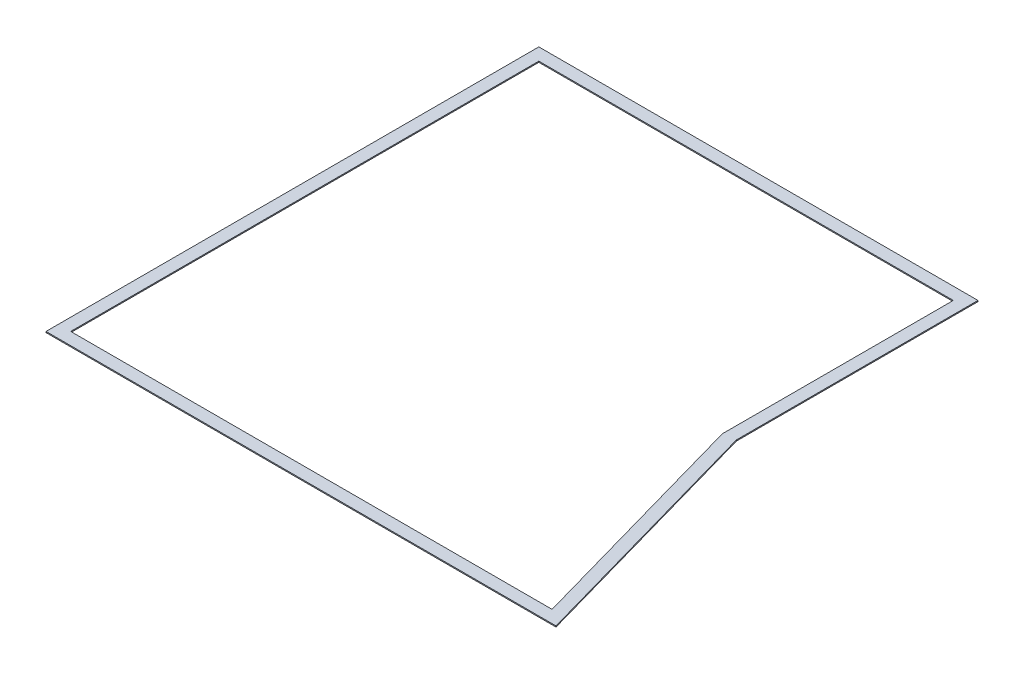
ISO-10303-21;
HEADER;
FILE_DESCRIPTION(('STEP AP214'),'2;1');
FILE_NAME('part.step','',(''),(''),'','','');
FILE_SCHEMA(('AUTOMOTIVE_DESIGN { 1 0 10303 214 1 1 1 1 }'));
ENDSEC;
DATA;
#1=APPLICATION_CONTEXT('core data for automotive mechanical design processes');
#2=APPLICATION_PROTOCOL_DEFINITION('international standard','automotive_design',2000,#1);
#3=PRODUCT_CONTEXT('',#1,'mechanical');
#4=PRODUCT('Part','Part','',(#3));
#5=PRODUCT_RELATED_PRODUCT_CATEGORY('part','',(#4));
#6=PRODUCT_DEFINITION_FORMATION('','',#4);
#7=PRODUCT_DEFINITION_CONTEXT('part definition',#1,'design');
#8=PRODUCT_DEFINITION('design','',#6,#7);
#9=PRODUCT_DEFINITION_SHAPE('','',#8);
#10=(LENGTH_UNIT() NAMED_UNIT(*) SI_UNIT(.MILLI.,.METRE.));
#11=(NAMED_UNIT(*) PLANE_ANGLE_UNIT() SI_UNIT($,.RADIAN.));
#12=(NAMED_UNIT(*) SI_UNIT($,.STERADIAN.) SOLID_ANGLE_UNIT());
#13=UNCERTAINTY_MEASURE_WITH_UNIT(LENGTH_MEASURE(1.E-05),#10,'distance_accuracy_value','');
#14=(GEOMETRIC_REPRESENTATION_CONTEXT(3) GLOBAL_UNCERTAINTY_ASSIGNED_CONTEXT((#13)) GLOBAL_UNIT_ASSIGNED_CONTEXT((#10,
#11,#12)) REPRESENTATION_CONTEXT('',''));
#15=CARTESIAN_POINT('',(0.,0.,0.));
#16=DIRECTION('',(0.,0.,1.));
#17=DIRECTION('',(1.,0.,0.));
#18=AXIS2_PLACEMENT_3D('',#15,#16,#17);
#19=CARTESIAN_POINT('',(0.,2.,0.));
#20=DIRECTION('',(0.,1.,0.));
#21=DIRECTION('',(0.,0.,1.));
#22=AXIS2_PLACEMENT_3D('',#19,#20,#21);
#23=PLANE('',#22);
#24=DIRECTION('',(-1.,0.,0.));
#25=VECTOR('',#24,1.);
#26=CARTESIAN_POINT('',(409.,2.,-458.));
#27=LINE('',#26,#25);
#28=CARTESIAN_POINT('',(409.,2.,-458.));
#29=VERTEX_POINT('',#28);
#30=CARTESIAN_POINT('',(-409.,2.,-458.));
#31=VERTEX_POINT('',#30);
#32=EDGE_CURVE('E156',#29,#31,#27,.T.);
#33=ORIENTED_EDGE('',*,*,#32,.T.);
#34=DIRECTION('',(0.,0.,1.));
#35=VECTOR('',#34,1.);
#36=CARTESIAN_POINT('',(-409.,2.,-458.));
#37=LINE('',#36,#35);
#38=CARTESIAN_POINT('',(-409.,2.,460.));
#39=VERTEX_POINT('',#38);
#40=EDGE_CURVE('E159',#31,#39,#37,.T.);
#41=ORIENTED_EDGE('',*,*,#40,.T.);
#42=DIRECTION('',(1.,0.,0.));
#43=VECTOR('',#42,1.);
#44=CARTESIAN_POINT('',(-409.,2.,460.));
#45=LINE('',#44,#43);
#46=CARTESIAN_POINT('',(541.,2.,460.));
#47=VERTEX_POINT('',#46);
#48=EDGE_CURVE('E162',#39,#47,#45,.T.);
#49=ORIENTED_EDGE('',*,*,#48,.T.);
#50=DIRECTION('',(-0.271460165021806,0.,-0.962449675986404));
#51=VECTOR('',#50,1.);
#52=CARTESIAN_POINT('',(541.,2.,460.));
#53=LINE('',#52,#51);
#54=CARTESIAN_POINT('',(409.,2.,-8.00000000000006));
#55=VERTEX_POINT('',#54);
#56=EDGE_CURVE('E164',#47,#55,#53,.T.);
#57=ORIENTED_EDGE('',*,*,#56,.T.);
#58=DIRECTION('',(0.,0.,-1.));
#59=VECTOR('',#58,1.);
#60=CARTESIAN_POINT('',(409.,2.,-8.00000000000006));
#61=LINE('',#60,#59);
#62=EDGE_CURVE('E166',#55,#29,#61,.T.);
#63=ORIENTED_EDGE('',*,*,#62,.T.);
#64=EDGE_LOOP('',(#33,#41,#49,#57,#63));
#65=FACE_BOUND('',#64,.T.);
#66=DIRECTION('',(-1.,0.,0.));
#67=VECTOR('',#66,1.);
#68=CARTESIAN_POINT('',(386.,2.,-435.));
#69=LINE('',#68,#67);
#70=CARTESIAN_POINT('',(386.,2.,-435.));
#71=VERTEX_POINT('',#70);
#72=CARTESIAN_POINT('',(-386.,2.,-435.));
#73=VERTEX_POINT('',#72);
#74=EDGE_CURVE('E120',#71,#73,#69,.T.);
#75=ORIENTED_EDGE('',*,*,#74,.F.);
#76=DIRECTION('',(0.,0.,-1.));
#77=VECTOR('',#76,1.);
#78=CARTESIAN_POINT('',(386.,2.,-4.81847444451644));
#79=LINE('',#78,#77);
#80=CARTESIAN_POINT('',(386.,2.,-4.81847444451644));
#81=VERTEX_POINT('',#80);
#82=EDGE_CURVE('E112',#81,#71,#79,.T.);
#83=ORIENTED_EDGE('',*,*,#82,.F.);
#84=DIRECTION('',(-0.271460165021806,0.,-0.962449675986404));
#85=VECTOR('',#84,1.);
#86=CARTESIAN_POINT('',(510.615467151017,2.,437.));
#87=LINE('',#86,#85);
#88=CARTESIAN_POINT('',(510.615467151017,2.,437.));
#89=VERTEX_POINT('',#88);
#90=EDGE_CURVE('E139',#89,#81,#87,.T.);
#91=ORIENTED_EDGE('',*,*,#90,.F.);
#92=DIRECTION('',(1.,0.,0.));
#93=VECTOR('',#92,1.);
#94=CARTESIAN_POINT('',(-386.,2.,437.));
#95=LINE('',#94,#93);
#96=CARTESIAN_POINT('',(-386.,2.,437.));
#97=VERTEX_POINT('',#96);
#98=EDGE_CURVE('E135',#97,#89,#95,.T.);
#99=ORIENTED_EDGE('',*,*,#98,.F.);
#100=DIRECTION('',(0.,0.,1.));
#101=VECTOR('',#100,1.);
#102=CARTESIAN_POINT('',(-386.,2.,-435.));
#103=LINE('',#102,#101);
#104=EDGE_CURVE('E133',#73,#97,#103,.T.);
#105=ORIENTED_EDGE('',*,*,#104,.F.);
#106=EDGE_LOOP('',(#75,#83,#91,#99,#105));
#107=FACE_BOUND('',#106,.T.);
#108=ADVANCED_FACE('F35',(#65,#107),#23,.T.);
#109=CARTESIAN_POINT('',(0.,0.,0.));
#110=DIRECTION('',(0.,1.,0.));
#111=DIRECTION('',(0.,0.,1.));
#112=AXIS2_PLACEMENT_3D('',#109,#110,#111);
#113=PLANE('',#112);
#114=DIRECTION('',(-1.,0.,0.));
#115=VECTOR('',#114,1.);
#116=CARTESIAN_POINT('',(409.,0.,-458.));
#117=LINE('',#116,#115);
#118=CARTESIAN_POINT('',(409.,0.,-458.));
#119=VERTEX_POINT('',#118);
#120=CARTESIAN_POINT('',(-409.,0.,-458.));
#121=VERTEX_POINT('',#120);
#122=EDGE_CURVE('E128',#119,#121,#117,.T.);
#123=ORIENTED_EDGE('',*,*,#122,.F.);
#124=DIRECTION('',(0.,0.,-1.));
#125=VECTOR('',#124,1.);
#126=CARTESIAN_POINT('',(409.,0.,-8.00000000000006));
#127=LINE('',#126,#125);
#128=CARTESIAN_POINT('',(409.,0.,-8.00000000000006));
#129=VERTEX_POINT('',#128);
#130=EDGE_CURVE('E160',#129,#119,#127,.T.);
#131=ORIENTED_EDGE('',*,*,#130,.F.);
#132=DIRECTION('',(-0.271460165021806,0.,-0.962449675986404));
#133=VECTOR('',#132,1.);
#134=CARTESIAN_POINT('',(541.,0.,460.));
#135=LINE('',#134,#133);
#136=CARTESIAN_POINT('',(541.,0.,460.));
#137=VERTEX_POINT('',#136);
#138=EDGE_CURVE('E175',#137,#129,#135,.T.);
#139=ORIENTED_EDGE('',*,*,#138,.F.);
#140=DIRECTION('',(1.,0.,0.));
#141=VECTOR('',#140,1.);
#142=CARTESIAN_POINT('',(-409.,0.,460.));
#143=LINE('',#142,#141);
#144=CARTESIAN_POINT('',(-409.,0.,460.));
#145=VERTEX_POINT('',#144);
#146=EDGE_CURVE('E173',#145,#137,#143,.T.);
#147=ORIENTED_EDGE('',*,*,#146,.F.);
#148=DIRECTION('',(0.,0.,1.));
#149=VECTOR('',#148,1.);
#150=CARTESIAN_POINT('',(-409.,0.,-458.));
#151=LINE('',#150,#149);
#152=EDGE_CURVE('E171',#121,#145,#151,.T.);
#153=ORIENTED_EDGE('',*,*,#152,.F.);
#154=EDGE_LOOP('',(#123,#131,#139,#147,#153));
#155=FACE_BOUND('',#154,.T.);
#156=DIRECTION('',(0.,0.,-1.));
#157=VECTOR('',#156,1.);
#158=CARTESIAN_POINT('',(386.,0.,-4.81847444451644));
#159=LINE('',#158,#157);
#160=CARTESIAN_POINT('',(386.,0.,-4.81847444451644));
#161=VERTEX_POINT('',#160);
#162=CARTESIAN_POINT('',(386.,0.,-435.));
#163=VERTEX_POINT('',#162);
#164=EDGE_CURVE('E58',#161,#163,#159,.T.);
#165=ORIENTED_EDGE('',*,*,#164,.T.);
#166=DIRECTION('',(-1.,0.,0.));
#167=VECTOR('',#166,1.);
#168=CARTESIAN_POINT('',(386.,0.,-435.));
#169=LINE('',#168,#167);
#170=CARTESIAN_POINT('',(-386.,0.,-435.));
#171=VERTEX_POINT('',#170);
#172=EDGE_CURVE('E127',#163,#171,#169,.T.);
#173=ORIENTED_EDGE('',*,*,#172,.T.);
#174=DIRECTION('',(0.,0.,1.));
#175=VECTOR('',#174,1.);
#176=CARTESIAN_POINT('',(-386.,0.,-435.));
#177=LINE('',#176,#175);
#178=CARTESIAN_POINT('',(-386.,0.,437.));
#179=VERTEX_POINT('',#178);
#180=EDGE_CURVE('E143',#171,#179,#177,.T.);
#181=ORIENTED_EDGE('',*,*,#180,.T.);
#182=DIRECTION('',(1.,0.,0.));
#183=VECTOR('',#182,1.);
#184=CARTESIAN_POINT('',(-386.,0.,437.));
#185=LINE('',#184,#183);
#186=CARTESIAN_POINT('',(510.615467151017,0.,437.));
#187=VERTEX_POINT('',#186);
#188=EDGE_CURVE('E146',#179,#187,#185,.T.);
#189=ORIENTED_EDGE('',*,*,#188,.T.);
#190=DIRECTION('',(-0.271460165021806,0.,-0.962449675986404));
#191=VECTOR('',#190,1.);
#192=CARTESIAN_POINT('',(510.615467151017,0.,437.));
#193=LINE('',#192,#191);
#194=EDGE_CURVE('E121',#187,#161,#193,.T.);
#195=ORIENTED_EDGE('',*,*,#194,.T.);
#196=EDGE_LOOP('',(#165,#173,#181,#189,#195));
#197=FACE_BOUND('',#196,.T.);
#198=ADVANCED_FACE('F196',(#155,#197),#113,.F.);
#199=CARTESIAN_POINT('',(409.,2.,-458.));
#200=DIRECTION('',(0.,0.,1.));
#201=DIRECTION('',(1.,0.,0.));
#202=AXIS2_PLACEMENT_3D('',#199,#200,#201);
#203=PLANE('',#202);
#204=ORIENTED_EDGE('',*,*,#122,.T.);
#205=DIRECTION('',(0.,-1.,0.));
#206=VECTOR('',#205,1.);
#207=CARTESIAN_POINT('',(-409.,2.,-458.));
#208=LINE('',#207,#206);
#209=EDGE_CURVE('E11',#31,#121,#208,.T.);
#210=ORIENTED_EDGE('',*,*,#209,.F.);
#211=ORIENTED_EDGE('',*,*,#32,.F.);
#212=DIRECTION('',(0.,-1.,0.));
#213=VECTOR('',#212,1.);
#214=CARTESIAN_POINT('',(409.,2.,-458.));
#215=LINE('',#214,#213);
#216=EDGE_CURVE('E168',#29,#119,#215,.T.);
#217=ORIENTED_EDGE('',*,*,#216,.T.);
#218=EDGE_LOOP('',(#204,#210,#211,#217));
#219=FACE_BOUND('',#218,.T.);
#220=ADVANCED_FACE('F37',(#219),#203,.F.);
#221=CARTESIAN_POINT('',(-409.,2.,-458.));
#222=DIRECTION('',(1.,0.,0.));
#223=DIRECTION('',(0.,0.,-1.));
#224=AXIS2_PLACEMENT_3D('',#221,#222,#223);
#225=PLANE('',#224);
#226=ORIENTED_EDGE('',*,*,#152,.T.);
#227=DIRECTION('',(0.,-1.,0.));
#228=VECTOR('',#227,1.);
#229=CARTESIAN_POINT('',(-409.,2.,460.));
#230=LINE('',#229,#228);
#231=EDGE_CURVE('E43',#39,#145,#230,.T.);
#232=ORIENTED_EDGE('',*,*,#231,.F.);
#233=ORIENTED_EDGE('',*,*,#40,.F.);
#234=ORIENTED_EDGE('',*,*,#209,.T.);
#235=EDGE_LOOP('',(#226,#232,#233,#234));
#236=FACE_BOUND('',#235,.T.);
#237=ADVANCED_FACE('F210',(#236),#225,.F.);
#238=CARTESIAN_POINT('',(-409.,2.,460.));
#239=DIRECTION('',(0.,0.,-1.));
#240=DIRECTION('',(-1.,0.,0.));
#241=AXIS2_PLACEMENT_3D('',#238,#239,#240);
#242=PLANE('',#241);
#243=ORIENTED_EDGE('',*,*,#146,.T.);
#244=DIRECTION('',(0.,-1.,0.));
#245=VECTOR('',#244,1.);
#246=CARTESIAN_POINT('',(541.,2.,460.));
#247=LINE('',#246,#245);
#248=EDGE_CURVE('E183',#47,#137,#247,.T.);
#249=ORIENTED_EDGE('',*,*,#248,.F.);
#250=ORIENTED_EDGE('',*,*,#48,.F.);
#251=ORIENTED_EDGE('',*,*,#231,.T.);
#252=EDGE_LOOP('',(#243,#249,#250,#251));
#253=FACE_BOUND('',#252,.T.);
#254=ADVANCED_FACE('F190',(#253),#242,.F.);
#255=CARTESIAN_POINT('',(541.,2.,460.));
#256=DIRECTION('',(-0.962449675986404,0.,0.271460165021806));
#257=DIRECTION('',(0.271460165021806,0.,0.962449675986404));
#258=AXIS2_PLACEMENT_3D('',#255,#256,#257);
#259=PLANE('',#258);
#260=ORIENTED_EDGE('',*,*,#138,.T.);
#261=DIRECTION('',(0.,-1.,0.));
#262=VECTOR('',#261,1.);
#263=CARTESIAN_POINT('',(409.,2.,-8.00000000000006));
#264=LINE('',#263,#262);
#265=EDGE_CURVE('E180',#55,#129,#264,.T.);
#266=ORIENTED_EDGE('',*,*,#265,.F.);
#267=ORIENTED_EDGE('',*,*,#56,.F.);
#268=ORIENTED_EDGE('',*,*,#248,.T.);
#269=EDGE_LOOP('',(#260,#266,#267,#268));
#270=FACE_BOUND('',#269,.T.);
#271=ADVANCED_FACE('F201',(#270),#259,.F.);
#272=CARTESIAN_POINT('',(409.,2.,-8.00000000000006));
#273=DIRECTION('',(-1.,0.,0.));
#274=DIRECTION('',(0.,0.,1.));
#275=AXIS2_PLACEMENT_3D('',#272,#273,#274);
#276=PLANE('',#275);
#277=ORIENTED_EDGE('',*,*,#130,.T.);
#278=ORIENTED_EDGE('',*,*,#216,.F.);
#279=ORIENTED_EDGE('',*,*,#62,.F.);
#280=ORIENTED_EDGE('',*,*,#265,.T.);
#281=EDGE_LOOP('',(#277,#278,#279,#280));
#282=FACE_BOUND('',#281,.T.);
#283=ADVANCED_FACE('F205',(#282),#276,.F.);
#284=CARTESIAN_POINT('',(386.,2.,-4.81847444451644));
#285=DIRECTION('',(-1.,0.,0.));
#286=DIRECTION('',(0.,0.,1.));
#287=AXIS2_PLACEMENT_3D('',#284,#285,#286);
#288=PLANE('',#287);
#289=ORIENTED_EDGE('',*,*,#164,.F.);
#290=DIRECTION('',(0.,-1.,0.));
#291=VECTOR('',#290,1.);
#292=CARTESIAN_POINT('',(386.,2.,-4.81847444451644));
#293=LINE('',#292,#291);
#294=EDGE_CURVE('E116',#81,#161,#293,.T.);
#295=ORIENTED_EDGE('',*,*,#294,.F.);
#296=ORIENTED_EDGE('',*,*,#82,.T.);
#297=DIRECTION('',(0.,-1.,0.));
#298=VECTOR('',#297,1.);
#299=CARTESIAN_POINT('',(386.,2.,-435.));
#300=LINE('',#299,#298);
#301=EDGE_CURVE('E115',#71,#163,#300,.T.);
#302=ORIENTED_EDGE('',*,*,#301,.T.);
#303=EDGE_LOOP('',(#289,#295,#296,#302));
#304=FACE_BOUND('',#303,.T.);
#305=ADVANCED_FACE('F114',(#304),#288,.T.);
#306=CARTESIAN_POINT('',(386.,2.,-435.));
#307=DIRECTION('',(0.,0.,1.));
#308=DIRECTION('',(1.,0.,0.));
#309=AXIS2_PLACEMENT_3D('',#306,#307,#308);
#310=PLANE('',#309);
#311=ORIENTED_EDGE('',*,*,#172,.F.);
#312=ORIENTED_EDGE('',*,*,#301,.F.);
#313=ORIENTED_EDGE('',*,*,#74,.T.);
#314=DIRECTION('',(0.,-1.,0.));
#315=VECTOR('',#314,1.);
#316=CARTESIAN_POINT('',(-386.,2.,-435.));
#317=LINE('',#316,#315);
#318=EDGE_CURVE('E129',#73,#171,#317,.T.);
#319=ORIENTED_EDGE('',*,*,#318,.T.);
#320=EDGE_LOOP('',(#311,#312,#313,#319));
#321=FACE_BOUND('',#320,.T.);
#322=ADVANCED_FACE('F124',(#321),#310,.T.);
#323=CARTESIAN_POINT('',(-386.,2.,-435.));
#324=DIRECTION('',(1.,0.,0.));
#325=DIRECTION('',(0.,0.,-1.));
#326=AXIS2_PLACEMENT_3D('',#323,#324,#325);
#327=PLANE('',#326);
#328=ORIENTED_EDGE('',*,*,#180,.F.);
#329=ORIENTED_EDGE('',*,*,#318,.F.);
#330=ORIENTED_EDGE('',*,*,#104,.T.);
#331=DIRECTION('',(0.,-1.,0.));
#332=VECTOR('',#331,1.);
#333=CARTESIAN_POINT('',(-386.,2.,437.));
#334=LINE('',#333,#332);
#335=EDGE_CURVE('E153',#97,#179,#334,.T.);
#336=ORIENTED_EDGE('',*,*,#335,.T.);
#337=EDGE_LOOP('',(#328,#329,#330,#336));
#338=FACE_BOUND('',#337,.T.);
#339=ADVANCED_FACE('F253',(#338),#327,.T.);
#340=CARTESIAN_POINT('',(-386.,2.,437.));
#341=DIRECTION('',(0.,0.,-1.));
#342=DIRECTION('',(-1.,0.,0.));
#343=AXIS2_PLACEMENT_3D('',#340,#341,#342);
#344=PLANE('',#343);
#345=ORIENTED_EDGE('',*,*,#188,.F.);
#346=ORIENTED_EDGE('',*,*,#335,.F.);
#347=ORIENTED_EDGE('',*,*,#98,.T.);
#348=DIRECTION('',(0.,-1.,0.));
#349=VECTOR('',#348,1.);
#350=CARTESIAN_POINT('',(510.615467151017,2.,437.));
#351=LINE('',#350,#349);
#352=EDGE_CURVE('E50',#89,#187,#351,.T.);
#353=ORIENTED_EDGE('',*,*,#352,.T.);
#354=EDGE_LOOP('',(#345,#346,#347,#353));
#355=FACE_BOUND('',#354,.T.);
#356=ADVANCED_FACE('F259',(#355),#344,.T.);
#357=CARTESIAN_POINT('',(510.615467151017,2.,437.));
#358=DIRECTION('',(-0.962449675986404,0.,0.271460165021806));
#359=DIRECTION('',(0.271460165021806,0.,0.962449675986404));
#360=AXIS2_PLACEMENT_3D('',#357,#358,#359);
#361=PLANE('',#360);
#362=ORIENTED_EDGE('',*,*,#194,.F.);
#363=ORIENTED_EDGE('',*,*,#352,.F.);
#364=ORIENTED_EDGE('',*,*,#90,.T.);
#365=ORIENTED_EDGE('',*,*,#294,.T.);
#366=EDGE_LOOP('',(#362,#363,#364,#365));
#367=FACE_BOUND('',#366,.T.);
#368=ADVANCED_FACE('F267',(#367),#361,.T.);
#369=CLOSED_SHELL('',(#108,#198,#220,#237,#254,#271,#283,#305,#322,#339,#356,#368));
#370=MANIFOLD_SOLID_BREP('B2',#369);
#371=ADVANCED_BREP_SHAPE_REPRESENTATION('',(#18,#370),#14);
#372=SHAPE_DEFINITION_REPRESENTATION(#9,#371);
ENDSEC;
END-ISO-10303-21;
